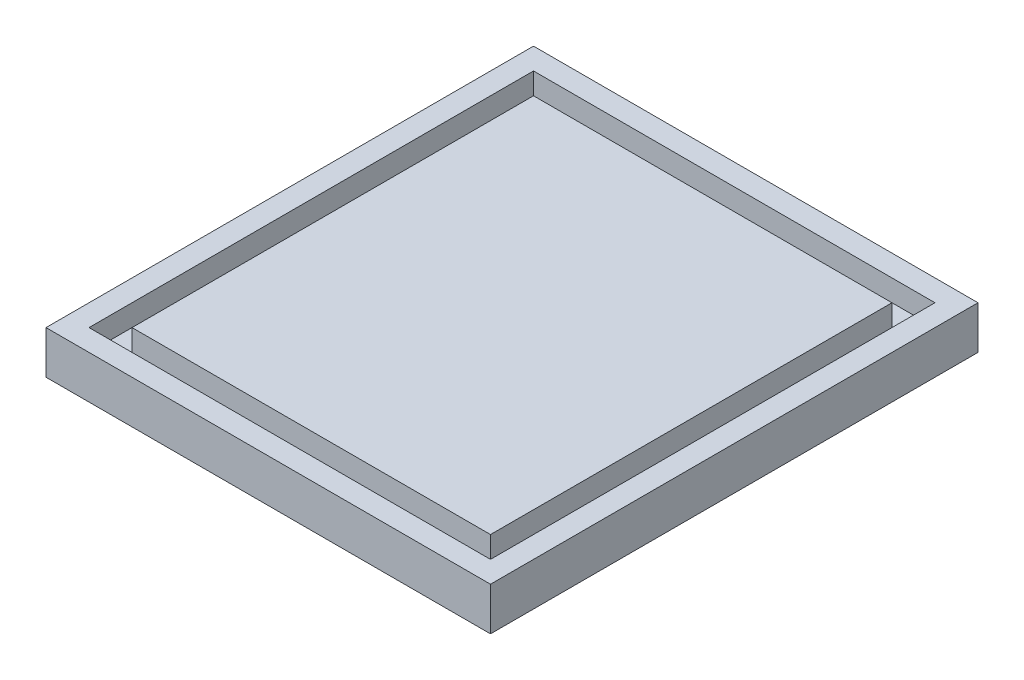
ISO-10303-21;
HEADER;
FILE_DESCRIPTION(('STEP AP214'),'2;1');
FILE_NAME('part.step','',(''),(''),'','','');
FILE_SCHEMA(('AUTOMOTIVE_DESIGN { 1 0 10303 214 1 1 1 1 }'));
ENDSEC;
DATA;
#1=APPLICATION_CONTEXT('core data for automotive mechanical design processes');
#2=APPLICATION_PROTOCOL_DEFINITION('international standard','automotive_design',2000,#1);
#3=PRODUCT_CONTEXT('',#1,'mechanical');
#4=PRODUCT('Part','Part','',(#3));
#5=PRODUCT_RELATED_PRODUCT_CATEGORY('part','',(#4));
#6=PRODUCT_DEFINITION_FORMATION('','',#4);
#7=PRODUCT_DEFINITION_CONTEXT('part definition',#1,'design');
#8=PRODUCT_DEFINITION('design','',#6,#7);
#9=PRODUCT_DEFINITION_SHAPE('','',#8);
#10=(LENGTH_UNIT() NAMED_UNIT(*) SI_UNIT(.MILLI.,.METRE.));
#11=(NAMED_UNIT(*) PLANE_ANGLE_UNIT() SI_UNIT($,.RADIAN.));
#12=(NAMED_UNIT(*) SI_UNIT($,.STERADIAN.) SOLID_ANGLE_UNIT());
#13=UNCERTAINTY_MEASURE_WITH_UNIT(LENGTH_MEASURE(1.E-05),#10,'distance_accuracy_value','');
#14=(GEOMETRIC_REPRESENTATION_CONTEXT(3) GLOBAL_UNCERTAINTY_ASSIGNED_CONTEXT((#13)) GLOBAL_UNIT_ASSIGNED_CONTEXT((#10,
#11,#12)) REPRESENTATION_CONTEXT('',''));
#15=CARTESIAN_POINT('',(0.,0.,0.));
#16=DIRECTION('',(0.,0.,1.));
#17=DIRECTION('',(1.,0.,0.));
#18=AXIS2_PLACEMENT_3D('',#15,#16,#17);
#19=CARTESIAN_POINT('',(0.,0.,0.));
#20=DIRECTION('',(0.,1.,0.));
#21=DIRECTION('',(0.,0.,1.));
#22=AXIS2_PLACEMENT_3D('',#19,#20,#21);
#23=PLANE('',#22);
#24=DIRECTION('',(0.,0.,1.));
#25=VECTOR('',#24,1.);
#26=CARTESIAN_POINT('',(-3.,0.,0.));
#27=LINE('',#26,#25);
#28=CARTESIAN_POINT('',(-3.,0.,-28.));
#29=VERTEX_POINT('',#28);
#30=CARTESIAN_POINT('',(-3.,0.,3.));
#31=VERTEX_POINT('',#30);
#32=EDGE_CURVE('E169',#29,#31,#27,.T.);
#33=ORIENTED_EDGE('',*,*,#32,.T.);
#34=DIRECTION('',(1.,0.,0.));
#35=VECTOR('',#34,1.);
#36=CARTESIAN_POINT('',(0.,0.,3.));
#37=LINE('',#36,#35);
#38=CARTESIAN_POINT('',(25.,0.,3.));
#39=VERTEX_POINT('',#38);
#40=EDGE_CURVE('E192',#31,#39,#37,.T.);
#41=ORIENTED_EDGE('',*,*,#40,.T.);
#42=DIRECTION('',(0.,0.,1.));
#43=VECTOR('',#42,1.);
#44=CARTESIAN_POINT('',(25.,0.,0.));
#45=LINE('',#44,#43);
#46=CARTESIAN_POINT('',(25.,0.,-28.));
#47=VERTEX_POINT('',#46);
#48=EDGE_CURVE('E215',#47,#39,#45,.T.);
#49=ORIENTED_EDGE('',*,*,#48,.F.);
#50=DIRECTION('',(1.,0.,0.));
#51=VECTOR('',#50,1.);
#52=CARTESIAN_POINT('',(0.,0.,-28.));
#53=LINE('',#52,#51);
#54=EDGE_CURVE('E82',#29,#47,#53,.T.);
#55=ORIENTED_EDGE('',*,*,#54,.F.);
#56=EDGE_LOOP('',(#33,#41,#49,#55));
#57=FACE_BOUND('',#56,.T.);
#58=DIRECTION('',(0.,0.,1.));
#59=VECTOR('',#58,1.);
#60=CARTESIAN_POINT('',(23.5,0.,0.));
#61=LINE('',#60,#59);
#62=CARTESIAN_POINT('',(23.5,0.,-26.5));
#63=VERTEX_POINT('',#62);
#64=CARTESIAN_POINT('',(23.5,0.,1.5));
#65=VERTEX_POINT('',#64);
#66=EDGE_CURVE('E180',#63,#65,#61,.T.);
#67=ORIENTED_EDGE('',*,*,#66,.T.);
#68=DIRECTION('',(1.,0.,0.));
#69=VECTOR('',#68,1.);
#70=CARTESIAN_POINT('',(0.,0.,1.5));
#71=LINE('',#70,#69);
#72=CARTESIAN_POINT('',(-1.5,0.,1.5));
#73=VERTEX_POINT('',#72);
#74=EDGE_CURVE('E165',#73,#65,#71,.T.);
#75=ORIENTED_EDGE('',*,*,#74,.F.);
#76=DIRECTION('',(0.,0.,1.));
#77=VECTOR('',#76,1.);
#78=CARTESIAN_POINT('',(-1.5,0.,0.));
#79=LINE('',#78,#77);
#80=CARTESIAN_POINT('',(-1.5,0.,-26.5));
#81=VERTEX_POINT('',#80);
#82=EDGE_CURVE('E159',#81,#73,#79,.T.);
#83=ORIENTED_EDGE('',*,*,#82,.F.);
#84=DIRECTION('',(1.,0.,0.));
#85=VECTOR('',#84,1.);
#86=CARTESIAN_POINT('',(0.,0.,-26.5));
#87=LINE('',#86,#85);
#88=EDGE_CURVE('E74',#81,#63,#87,.T.);
#89=ORIENTED_EDGE('',*,*,#88,.T.);
#90=EDGE_LOOP('',(#67,#75,#83,#89));
#91=FACE_BOUND('',#90,.T.);
#92=ADVANCED_FACE('F57',(#57,#91),#23,.T.);
#93=CARTESIAN_POINT('',(-4.5,-1.5,0.));
#94=DIRECTION('',(-1.,0.,0.));
#95=DIRECTION('',(0.,0.,1.));
#96=AXIS2_PLACEMENT_3D('',#93,#94,#95);
#97=PLANE('',#96);
#98=DIRECTION('',(0.,1.,0.));
#99=VECTOR('',#98,1.);
#100=CARTESIAN_POINT('',(-4.5,-1.5,4.50000000000001));
#101=LINE('',#100,#99);
#102=CARTESIAN_POINT('',(-4.5,-1.5,4.50000000000001));
#103=VERTEX_POINT('',#102);
#104=CARTESIAN_POINT('',(-4.5,1.5,4.50000000000001));
#105=VERTEX_POINT('',#104);
#106=EDGE_CURVE('E61',#103,#105,#101,.T.);
#107=ORIENTED_EDGE('',*,*,#106,.T.);
#108=DIRECTION('',(0.,0.,1.));
#109=VECTOR('',#108,1.);
#110=CARTESIAN_POINT('',(-4.5,1.5,0.));
#111=LINE('',#110,#109);
#112=CARTESIAN_POINT('',(-4.50000000000001,1.5,-29.5));
#113=VERTEX_POINT('',#112);
#114=EDGE_CURVE('E198',#113,#105,#111,.T.);
#115=ORIENTED_EDGE('',*,*,#114,.F.);
#116=DIRECTION('',(0.,1.,0.));
#117=VECTOR('',#116,1.);
#118=CARTESIAN_POINT('',(-4.50000000000001,-1.5,-29.5));
#119=LINE('',#118,#117);
#120=CARTESIAN_POINT('',(-4.50000000000001,-1.5,-29.5));
#121=VERTEX_POINT('',#120);
#122=EDGE_CURVE('E12',#121,#113,#119,.T.);
#123=ORIENTED_EDGE('',*,*,#122,.F.);
#124=DIRECTION('',(0.,0.,1.));
#125=VECTOR('',#124,1.);
#126=CARTESIAN_POINT('',(-4.5,-1.5,0.));
#127=LINE('',#126,#125);
#128=EDGE_CURVE('E229',#121,#103,#127,.T.);
#129=ORIENTED_EDGE('',*,*,#128,.T.);
#130=EDGE_LOOP('',(#107,#115,#123,#129));
#131=FACE_BOUND('',#130,.T.);
#132=ADVANCED_FACE('F59',(#131),#97,.T.);
#133=CARTESIAN_POINT('',(0.,-1.5,-29.5));
#134=DIRECTION('',(0.,0.,1.));
#135=DIRECTION('',(1.,0.,0.));
#136=AXIS2_PLACEMENT_3D('',#133,#134,#135);
#137=PLANE('',#136);
#138=ORIENTED_EDGE('',*,*,#122,.T.);
#139=DIRECTION('',(1.,0.,0.));
#140=VECTOR('',#139,1.);
#141=CARTESIAN_POINT('',(0.,1.5,-29.5));
#142=LINE('',#141,#140);
#143=CARTESIAN_POINT('',(26.5,1.5,-29.5));
#144=VERTEX_POINT('',#143);
#145=EDGE_CURVE('E195',#113,#144,#142,.T.);
#146=ORIENTED_EDGE('',*,*,#145,.T.);
#147=DIRECTION('',(0.,1.,0.));
#148=VECTOR('',#147,1.);
#149=CARTESIAN_POINT('',(26.5,-1.5,-29.5));
#150=LINE('',#149,#148);
#151=CARTESIAN_POINT('',(26.5,-1.5,-29.5));
#152=VERTEX_POINT('',#151);
#153=EDGE_CURVE('E66',#152,#144,#150,.T.);
#154=ORIENTED_EDGE('',*,*,#153,.F.);
#155=DIRECTION('',(1.,0.,0.));
#156=VECTOR('',#155,1.);
#157=CARTESIAN_POINT('',(0.,-1.5,-29.5));
#158=LINE('',#157,#156);
#159=EDGE_CURVE('E237',#121,#152,#158,.T.);
#160=ORIENTED_EDGE('',*,*,#159,.F.);
#161=EDGE_LOOP('',(#138,#146,#154,#160));
#162=FACE_BOUND('',#161,.T.);
#163=ADVANCED_FACE('F263',(#162),#137,.F.);
#164=CARTESIAN_POINT('',(26.5,-1.5,0.));
#165=DIRECTION('',(-1.,0.,0.));
#166=DIRECTION('',(0.,0.,1.));
#167=AXIS2_PLACEMENT_3D('',#164,#165,#166);
#168=PLANE('',#167);
#169=ORIENTED_EDGE('',*,*,#153,.T.);
#170=DIRECTION('',(0.,0.,1.));
#171=VECTOR('',#170,1.);
#172=CARTESIAN_POINT('',(26.5,1.5,0.));
#173=LINE('',#172,#171);
#174=CARTESIAN_POINT('',(26.5,1.5,4.5));
#175=VERTEX_POINT('',#174);
#176=EDGE_CURVE('E191',#144,#175,#173,.T.);
#177=ORIENTED_EDGE('',*,*,#176,.T.);
#178=DIRECTION('',(0.,1.,0.));
#179=VECTOR('',#178,1.);
#180=CARTESIAN_POINT('',(26.5,-1.5,4.5));
#181=LINE('',#180,#179);
#182=CARTESIAN_POINT('',(26.5,-1.5,4.5));
#183=VERTEX_POINT('',#182);
#184=EDGE_CURVE('E239',#183,#175,#181,.T.);
#185=ORIENTED_EDGE('',*,*,#184,.F.);
#186=DIRECTION('',(0.,0.,1.));
#187=VECTOR('',#186,1.);
#188=CARTESIAN_POINT('',(26.5,-1.5,0.));
#189=LINE('',#188,#187);
#190=EDGE_CURVE('E235',#152,#183,#189,.T.);
#191=ORIENTED_EDGE('',*,*,#190,.F.);
#192=EDGE_LOOP('',(#169,#177,#185,#191));
#193=FACE_BOUND('',#192,.T.);
#194=ADVANCED_FACE('F255',(#193),#168,.F.);
#195=CARTESIAN_POINT('',(0.,-1.5,4.50000000000001));
#196=DIRECTION('',(0.,0.,1.));
#197=DIRECTION('',(1.,0.,0.));
#198=AXIS2_PLACEMENT_3D('',#195,#196,#197);
#199=PLANE('',#198);
#200=ORIENTED_EDGE('',*,*,#184,.T.);
#201=DIRECTION('',(1.,0.,0.));
#202=VECTOR('',#201,1.);
#203=CARTESIAN_POINT('',(0.,1.5,4.50000000000001));
#204=LINE('',#203,#202);
#205=EDGE_CURVE('E188',#105,#175,#204,.T.);
#206=ORIENTED_EDGE('',*,*,#205,.F.);
#207=ORIENTED_EDGE('',*,*,#106,.F.);
#208=DIRECTION('',(1.,0.,0.));
#209=VECTOR('',#208,1.);
#210=CARTESIAN_POINT('',(0.,-1.5,4.50000000000001));
#211=LINE('',#210,#209);
#212=EDGE_CURVE('E232',#103,#183,#211,.T.);
#213=ORIENTED_EDGE('',*,*,#212,.T.);
#214=EDGE_LOOP('',(#200,#206,#207,#213));
#215=FACE_BOUND('',#214,.T.);
#216=ADVANCED_FACE('F252',(#215),#199,.T.);
#217=CARTESIAN_POINT('',(0.,-1.5,0.));
#218=DIRECTION('',(0.,1.,0.));
#219=DIRECTION('',(0.,0.,1.));
#220=AXIS2_PLACEMENT_3D('',#217,#218,#219);
#221=PLANE('',#220);
#222=ORIENTED_EDGE('',*,*,#128,.F.);
#223=ORIENTED_EDGE('',*,*,#159,.T.);
#224=ORIENTED_EDGE('',*,*,#190,.T.);
#225=ORIENTED_EDGE('',*,*,#212,.F.);
#226=EDGE_LOOP('',(#222,#223,#224,#225));
#227=FACE_BOUND('',#226,.T.);
#228=ADVANCED_FACE('F254',(#227),#221,.F.);
#229=CARTESIAN_POINT('',(-3.,1.5,0.));
#230=DIRECTION('',(1.,0.,0.));
#231=DIRECTION('',(0.,0.,-1.));
#232=AXIS2_PLACEMENT_3D('',#229,#230,#231);
#233=PLANE('',#232);
#234=ORIENTED_EDGE('',*,*,#32,.F.);
#235=DIRECTION('',(0.,-1.,0.));
#236=VECTOR('',#235,1.);
#237=CARTESIAN_POINT('',(-3.,1.5,-28.));
#238=LINE('',#237,#236);
#239=CARTESIAN_POINT('',(-3.,1.5,-28.));
#240=VERTEX_POINT('',#239);
#241=EDGE_CURVE('E227',#240,#29,#238,.T.);
#242=ORIENTED_EDGE('',*,*,#241,.F.);
#243=DIRECTION('',(0.,0.,1.));
#244=VECTOR('',#243,1.);
#245=CARTESIAN_POINT('',(-3.,1.5,0.));
#246=LINE('',#245,#244);
#247=CARTESIAN_POINT('',(-3.,1.5,3.));
#248=VERTEX_POINT('',#247);
#249=EDGE_CURVE('E201',#240,#248,#246,.T.);
#250=ORIENTED_EDGE('',*,*,#249,.T.);
#251=DIRECTION('',(0.,-1.,0.));
#252=VECTOR('',#251,1.);
#253=CARTESIAN_POINT('',(-3.,1.5,3.));
#254=LINE('',#253,#252);
#255=EDGE_CURVE('E212',#248,#31,#254,.T.);
#256=ORIENTED_EDGE('',*,*,#255,.T.);
#257=EDGE_LOOP('',(#234,#242,#250,#256));
#258=FACE_BOUND('',#257,.T.);
#259=ADVANCED_FACE('F260',(#258),#233,.T.);
#260=CARTESIAN_POINT('',(0.,1.5,-28.));
#261=DIRECTION('',(0.,0.,-1.));
#262=DIRECTION('',(-1.,0.,0.));
#263=AXIS2_PLACEMENT_3D('',#260,#261,#262);
#264=PLANE('',#263);
#265=ORIENTED_EDGE('',*,*,#54,.T.);
#266=DIRECTION('',(0.,-1.,0.));
#267=VECTOR('',#266,1.);
#268=CARTESIAN_POINT('',(25.,1.5,-28.));
#269=LINE('',#268,#267);
#270=CARTESIAN_POINT('',(25.,1.5,-28.));
#271=VERTEX_POINT('',#270);
#272=EDGE_CURVE('E224',#271,#47,#269,.T.);
#273=ORIENTED_EDGE('',*,*,#272,.F.);
#274=DIRECTION('',(1.,0.,0.));
#275=VECTOR('',#274,1.);
#276=CARTESIAN_POINT('',(0.,1.5,-28.));
#277=LINE('',#276,#275);
#278=EDGE_CURVE('E204',#240,#271,#277,.T.);
#279=ORIENTED_EDGE('',*,*,#278,.F.);
#280=ORIENTED_EDGE('',*,*,#241,.T.);
#281=EDGE_LOOP('',(#265,#273,#279,#280));
#282=FACE_BOUND('',#281,.T.);
#283=ADVANCED_FACE('F303',(#282),#264,.F.);
#284=CARTESIAN_POINT('',(25.,1.5,0.));
#285=DIRECTION('',(1.,0.,0.));
#286=DIRECTION('',(0.,0.,-1.));
#287=AXIS2_PLACEMENT_3D('',#284,#285,#286);
#288=PLANE('',#287);
#289=ORIENTED_EDGE('',*,*,#48,.T.);
#290=DIRECTION('',(0.,-1.,0.));
#291=VECTOR('',#290,1.);
#292=CARTESIAN_POINT('',(25.,1.5,3.));
#293=LINE('',#292,#291);
#294=CARTESIAN_POINT('',(25.,1.5,3.));
#295=VERTEX_POINT('',#294);
#296=EDGE_CURVE('E221',#295,#39,#293,.T.);
#297=ORIENTED_EDGE('',*,*,#296,.F.);
#298=DIRECTION('',(0.,0.,1.));
#299=VECTOR('',#298,1.);
#300=CARTESIAN_POINT('',(25.,1.5,0.));
#301=LINE('',#300,#299);
#302=EDGE_CURVE('E207',#271,#295,#301,.T.);
#303=ORIENTED_EDGE('',*,*,#302,.F.);
#304=ORIENTED_EDGE('',*,*,#272,.T.);
#305=EDGE_LOOP('',(#289,#297,#303,#304));
#306=FACE_BOUND('',#305,.T.);
#307=ADVANCED_FACE('F312',(#306),#288,.F.);
#308=CARTESIAN_POINT('',(0.,1.5,3.));
#309=DIRECTION('',(0.,0.,-1.));
#310=DIRECTION('',(-1.,0.,0.));
#311=AXIS2_PLACEMENT_3D('',#308,#309,#310);
#312=PLANE('',#311);
#313=ORIENTED_EDGE('',*,*,#40,.F.);
#314=ORIENTED_EDGE('',*,*,#255,.F.);
#315=DIRECTION('',(1.,0.,0.));
#316=VECTOR('',#315,1.);
#317=CARTESIAN_POINT('',(0.,1.5,3.));
#318=LINE('',#317,#316);
#319=EDGE_CURVE('E209',#248,#295,#318,.T.);
#320=ORIENTED_EDGE('',*,*,#319,.T.);
#321=ORIENTED_EDGE('',*,*,#296,.T.);
#322=EDGE_LOOP('',(#313,#314,#320,#321));
#323=FACE_BOUND('',#322,.T.);
#324=ADVANCED_FACE('F322',(#323),#312,.T.);
#325=CARTESIAN_POINT('',(0.,1.5,0.));
#326=DIRECTION('',(0.,1.,0.));
#327=DIRECTION('',(0.,0.,1.));
#328=AXIS2_PLACEMENT_3D('',#325,#326,#327);
#329=PLANE('',#328);
#330=ORIENTED_EDGE('',*,*,#205,.T.);
#331=ORIENTED_EDGE('',*,*,#176,.F.);
#332=ORIENTED_EDGE('',*,*,#145,.F.);
#333=ORIENTED_EDGE('',*,*,#114,.T.);
#334=EDGE_LOOP('',(#330,#331,#332,#333));
#335=FACE_BOUND('',#334,.T.);
#336=ORIENTED_EDGE('',*,*,#249,.F.);
#337=ORIENTED_EDGE('',*,*,#278,.T.);
#338=ORIENTED_EDGE('',*,*,#302,.T.);
#339=ORIENTED_EDGE('',*,*,#319,.F.);
#340=EDGE_LOOP('',(#336,#337,#338,#339));
#341=FACE_BOUND('',#340,.T.);
#342=ADVANCED_FACE('F249',(#335,#341),#329,.T.);
#343=CARTESIAN_POINT('',(0.,1.5,1.5));
#344=DIRECTION('',(0.,0.,-1.));
#345=DIRECTION('',(-1.,0.,0.));
#346=AXIS2_PLACEMENT_3D('',#343,#344,#345);
#347=PLANE('',#346);
#348=ORIENTED_EDGE('',*,*,#74,.T.);
#349=DIRECTION('',(0.,-1.,0.));
#350=VECTOR('',#349,1.);
#351=CARTESIAN_POINT('',(23.5,1.5,1.5));
#352=LINE('',#351,#350);
#353=CARTESIAN_POINT('',(23.5,1.5,1.5));
#354=VERTEX_POINT('',#353);
#355=EDGE_CURVE('E162',#354,#65,#352,.T.);
#356=ORIENTED_EDGE('',*,*,#355,.F.);
#357=DIRECTION('',(1.,0.,0.));
#358=VECTOR('',#357,1.);
#359=CARTESIAN_POINT('',(0.,1.5,1.5));
#360=LINE('',#359,#358);
#361=CARTESIAN_POINT('',(-1.5,1.5,1.5));
#362=VERTEX_POINT('',#361);
#363=EDGE_CURVE('E147',#362,#354,#360,.T.);
#364=ORIENTED_EDGE('',*,*,#363,.F.);
#365=DIRECTION('',(0.,-1.,0.));
#366=VECTOR('',#365,1.);
#367=CARTESIAN_POINT('',(-1.5,1.5,1.5));
#368=LINE('',#367,#366);
#369=EDGE_CURVE('E178',#362,#73,#368,.T.);
#370=ORIENTED_EDGE('',*,*,#369,.T.);
#371=EDGE_LOOP('',(#348,#356,#364,#370));
#372=FACE_BOUND('',#371,.T.);
#373=ADVANCED_FACE('F163',(#372),#347,.F.);
#374=CARTESIAN_POINT('',(23.5,1.5,0.));
#375=DIRECTION('',(1.,0.,0.));
#376=DIRECTION('',(0.,0.,-1.));
#377=AXIS2_PLACEMENT_3D('',#374,#375,#376);
#378=PLANE('',#377);
#379=ORIENTED_EDGE('',*,*,#66,.F.);
#380=DIRECTION('',(0.,-1.,0.));
#381=VECTOR('',#380,1.);
#382=CARTESIAN_POINT('',(23.5,1.5,-26.5));
#383=LINE('',#382,#381);
#384=CARTESIAN_POINT('',(23.5,1.5,-26.5));
#385=VERTEX_POINT('',#384);
#386=EDGE_CURVE('E170',#385,#63,#383,.T.);
#387=ORIENTED_EDGE('',*,*,#386,.F.);
#388=DIRECTION('',(0.,0.,1.));
#389=VECTOR('',#388,1.);
#390=CARTESIAN_POINT('',(23.5,1.5,0.));
#391=LINE('',#390,#389);
#392=EDGE_CURVE('E152',#385,#354,#391,.T.);
#393=ORIENTED_EDGE('',*,*,#392,.T.);
#394=ORIENTED_EDGE('',*,*,#355,.T.);
#395=EDGE_LOOP('',(#379,#387,#393,#394));
#396=FACE_BOUND('',#395,.T.);
#397=ADVANCED_FACE('F172',(#396),#378,.T.);
#398=CARTESIAN_POINT('',(0.,1.5,-26.5));
#399=DIRECTION('',(0.,0.,-1.));
#400=DIRECTION('',(-1.,0.,0.));
#401=AXIS2_PLACEMENT_3D('',#398,#399,#400);
#402=PLANE('',#401);
#403=ORIENTED_EDGE('',*,*,#88,.F.);
#404=DIRECTION('',(0.,-1.,0.));
#405=VECTOR('',#404,1.);
#406=CARTESIAN_POINT('',(-1.5,1.5,-26.5));
#407=LINE('',#406,#405);
#408=CARTESIAN_POINT('',(-1.5,1.5,-26.5));
#409=VERTEX_POINT('',#408);
#410=EDGE_CURVE('E185',#409,#81,#407,.T.);
#411=ORIENTED_EDGE('',*,*,#410,.F.);
#412=DIRECTION('',(1.,0.,0.));
#413=VECTOR('',#412,1.);
#414=CARTESIAN_POINT('',(0.,1.5,-26.5));
#415=LINE('',#414,#413);
#416=EDGE_CURVE('E173',#409,#385,#415,.T.);
#417=ORIENTED_EDGE('',*,*,#416,.T.);
#418=ORIENTED_EDGE('',*,*,#386,.T.);
#419=EDGE_LOOP('',(#403,#411,#417,#418));
#420=FACE_BOUND('',#419,.T.);
#421=ADVANCED_FACE('F359',(#420),#402,.T.);
#422=CARTESIAN_POINT('',(-1.5,1.5,0.));
#423=DIRECTION('',(1.,0.,0.));
#424=DIRECTION('',(0.,0.,-1.));
#425=AXIS2_PLACEMENT_3D('',#422,#423,#424);
#426=PLANE('',#425);
#427=ORIENTED_EDGE('',*,*,#82,.T.);
#428=ORIENTED_EDGE('',*,*,#369,.F.);
#429=DIRECTION('',(0.,0.,1.));
#430=VECTOR('',#429,1.);
#431=CARTESIAN_POINT('',(-1.5,1.5,0.));
#432=LINE('',#431,#430);
#433=EDGE_CURVE('E155',#409,#362,#432,.T.);
#434=ORIENTED_EDGE('',*,*,#433,.F.);
#435=ORIENTED_EDGE('',*,*,#410,.T.);
#436=EDGE_LOOP('',(#427,#428,#434,#435));
#437=FACE_BOUND('',#436,.T.);
#438=ADVANCED_FACE('F368',(#437),#426,.F.);
#439=CARTESIAN_POINT('',(0.,1.5,0.));
#440=DIRECTION('',(0.,1.,0.));
#441=DIRECTION('',(0.,0.,1.));
#442=AXIS2_PLACEMENT_3D('',#439,#440,#441);
#443=PLANE('',#442);
#444=ORIENTED_EDGE('',*,*,#363,.T.);
#445=ORIENTED_EDGE('',*,*,#392,.F.);
#446=ORIENTED_EDGE('',*,*,#416,.F.);
#447=ORIENTED_EDGE('',*,*,#433,.T.);
#448=EDGE_LOOP('',(#444,#445,#446,#447));
#449=FACE_BOUND('',#448,.T.);
#450=ADVANCED_FACE('F149',(#449),#443,.T.);
#451=CLOSED_SHELL('',(#92,#132,#163,#194,#216,#228,#259,#283,#307,#324,#342,#373,#397,#421,#438,#450));
#452=MANIFOLD_SOLID_BREP('B2',#451);
#453=ADVANCED_BREP_SHAPE_REPRESENTATION('',(#18,#452),#14);
#454=SHAPE_DEFINITION_REPRESENTATION(#9,#453);
ENDSEC;
END-ISO-10303-21;
